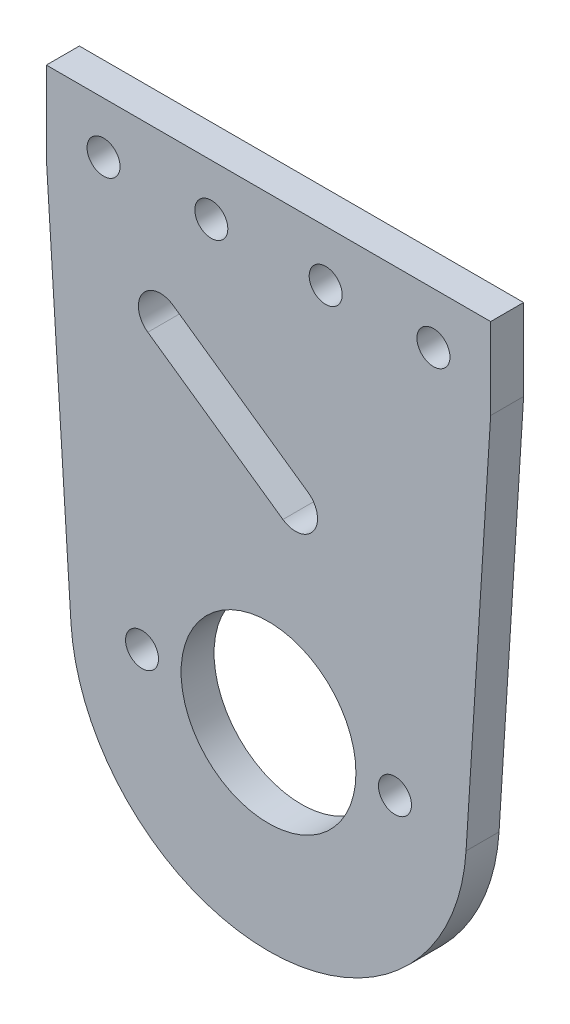
ISO-10303-21;
HEADER;
FILE_DESCRIPTION(('STEP AP214'),'2;1');
FILE_NAME('part.step','',(''),(''),'','','');
FILE_SCHEMA(('AUTOMOTIVE_DESIGN { 1 0 10303 214 1 1 1 1 }'));
ENDSEC;
DATA;
#1=APPLICATION_CONTEXT('core data for automotive mechanical design processes');
#2=APPLICATION_PROTOCOL_DEFINITION('international standard','automotive_design',2000,#1);
#3=PRODUCT_CONTEXT('',#1,'mechanical');
#4=PRODUCT('Part','Part','',(#3));
#5=PRODUCT_RELATED_PRODUCT_CATEGORY('part','',(#4));
#6=PRODUCT_DEFINITION_FORMATION('','',#4);
#7=PRODUCT_DEFINITION_CONTEXT('part definition',#1,'design');
#8=PRODUCT_DEFINITION('design','',#6,#7);
#9=PRODUCT_DEFINITION_SHAPE('','',#8);
#10=(LENGTH_UNIT() NAMED_UNIT(*) SI_UNIT(.MILLI.,.METRE.));
#11=(NAMED_UNIT(*) PLANE_ANGLE_UNIT() SI_UNIT($,.RADIAN.));
#12=(NAMED_UNIT(*) SI_UNIT($,.STERADIAN.) SOLID_ANGLE_UNIT());
#13=UNCERTAINTY_MEASURE_WITH_UNIT(LENGTH_MEASURE(1.E-05),#10,'distance_accuracy_value','');
#14=(GEOMETRIC_REPRESENTATION_CONTEXT(3) GLOBAL_UNCERTAINTY_ASSIGNED_CONTEXT((#13)) GLOBAL_UNIT_ASSIGNED_CONTEXT((#10,
#11,#12)) REPRESENTATION_CONTEXT('',''));
#15=CARTESIAN_POINT('',(0.,0.,0.));
#16=DIRECTION('',(0.,0.,1.));
#17=DIRECTION('',(1.,0.,0.));
#18=AXIS2_PLACEMENT_3D('',#15,#16,#17);
#19=CARTESIAN_POINT('',(0.,0.,3.));
#20=DIRECTION('',(0.,0.,1.));
#21=DIRECTION('',(1.,0.,0.));
#22=AXIS2_PLACEMENT_3D('',#19,#20,#21);
#23=PLANE('',#22);
#24=CARTESIAN_POINT('',(-9.82982453146787,26.8829172362126,3.));
#25=DIRECTION('',(0.,0.,1.));
#26=DIRECTION('',(1.,0.,0.));
#27=AXIS2_PLACEMENT_3D('',#24,#25,#26);
#28=CIRCLE('',#27,2.);
#29=CARTESIAN_POINT('',(-8.68267165876577,28.5212213247906,3.));
#30=VERTEX_POINT('',#29);
#31=CARTESIAN_POINT('',(-10.97697740417,25.2446131476346,3.));
#32=VERTEX_POINT('',#31);
#33=EDGE_CURVE('E50',#30,#32,#28,.T.);
#34=ORIENTED_EDGE('',*,*,#33,.F.);
#35=DIRECTION('',(-0.819152044288989,0.57357643635105,0.));
#36=VECTOR('',#35,1.);
#37=CARTESIAN_POINT('',(-8.68267165876577,28.5212213247906,3.));
#38=LINE('',#37,#36);
#39=CARTESIAN_POINT('',(3.60460900556907,19.9175747795248,3.));
#40=VERTEX_POINT('',#39);
#41=EDGE_CURVE('E130',#40,#30,#38,.T.);
#42=ORIENTED_EDGE('',*,*,#41,.F.);
#43=CARTESIAN_POINT('',(2.45745613286697,18.2792706909468,3.));
#44=DIRECTION('',(0.,0.,1.));
#45=DIRECTION('',(1.,0.,0.));
#46=AXIS2_PLACEMENT_3D('',#43,#44,#45);
#47=CIRCLE('',#46,2.);
#48=CARTESIAN_POINT('',(1.31030326016487,16.6409666023689,3.));
#49=VERTEX_POINT('',#48);
#50=EDGE_CURVE('E133',#49,#40,#47,.T.);
#51=ORIENTED_EDGE('',*,*,#50,.F.);
#52=DIRECTION('',(0.819152044288989,-0.57357643635105,0.));
#53=VECTOR('',#52,1.);
#54=CARTESIAN_POINT('',(-10.97697740417,25.2446131476346,3.));
#55=LINE('',#54,#53);
#56=EDGE_CURVE('E139',#32,#49,#55,.T.);
#57=ORIENTED_EDGE('',*,*,#56,.F.);
#58=EDGE_LOOP('',(#34,#42,#51,#57));
#59=FACE_BOUND('',#58,.T.);
#60=CARTESIAN_POINT('',(11.5,0.,3.));
#61=DIRECTION('',(0.,0.,1.));
#62=DIRECTION('',(1.,0.,0.));
#63=AXIS2_PLACEMENT_3D('',#60,#61,#62);
#64=CIRCLE('',#63,1.5);
#65=CARTESIAN_POINT('',(13.,0.,3.));
#66=VERTEX_POINT('',#65);
#67=EDGE_CURVE('E145',#66,#66,#64,.T.);
#68=ORIENTED_EDGE('',*,*,#67,.F.);
#69=EDGE_LOOP('',(#68));
#70=FACE_BOUND('',#69,.T.);
#71=CARTESIAN_POINT('',(-11.5,0.,3.));
#72=DIRECTION('',(0.,0.,1.));
#73=DIRECTION('',(1.,0.,0.));
#74=AXIS2_PLACEMENT_3D('',#71,#72,#73);
#75=CIRCLE('',#74,1.5);
#76=CARTESIAN_POINT('',(-10.,0.,3.));
#77=VERTEX_POINT('',#76);
#78=EDGE_CURVE('E154',#77,#77,#75,.T.);
#79=ORIENTED_EDGE('',*,*,#78,.F.);
#80=EDGE_LOOP('',(#79));
#81=FACE_BOUND('',#80,.T.);
#82=CARTESIAN_POINT('',(5.19999999999999,37.0240523814777,3.));
#83=DIRECTION('',(0.,0.,1.));
#84=DIRECTION('',(1.,0.,0.));
#85=AXIS2_PLACEMENT_3D('',#82,#83,#84);
#86=CIRCLE('',#85,1.5);
#87=CARTESIAN_POINT('',(6.69999999999999,37.0240523814777,3.));
#88=VERTEX_POINT('',#87);
#89=EDGE_CURVE('E167',#88,#88,#86,.T.);
#90=ORIENTED_EDGE('',*,*,#89,.F.);
#91=EDGE_LOOP('',(#90));
#92=FACE_BOUND('',#91,.T.);
#93=CARTESIAN_POINT('',(-15.,37.0240523814777,3.));
#94=DIRECTION('',(0.,0.,1.));
#95=DIRECTION('',(1.,0.,0.));
#96=AXIS2_PLACEMENT_3D('',#93,#94,#95);
#97=CIRCLE('',#96,1.5);
#98=CARTESIAN_POINT('',(-13.5,37.0240523814777,3.));
#99=VERTEX_POINT('',#98);
#100=EDGE_CURVE('E179',#99,#99,#97,.T.);
#101=ORIENTED_EDGE('',*,*,#100,.F.);
#102=EDGE_LOOP('',(#101));
#103=FACE_BOUND('',#102,.T.);
#104=DIRECTION('',(-1.,0.,0.));
#105=VECTOR('',#104,1.);
#106=CARTESIAN_POINT('',(-20.2,41.6740523814777,3.));
#107=LINE('',#106,#105);
#108=CARTESIAN_POINT('',(20.2,41.6740523814777,3.));
#109=VERTEX_POINT('',#108);
#110=CARTESIAN_POINT('',(-20.2,41.6740523814777,3.));
#111=VERTEX_POINT('',#110);
#112=EDGE_CURVE('E191',#109,#111,#107,.T.);
#113=ORIENTED_EDGE('',*,*,#112,.T.);
#114=DIRECTION('',(0.,-1.,0.));
#115=VECTOR('',#114,1.);
#116=CARTESIAN_POINT('',(-20.2,41.6740523814777,3.));
#117=LINE('',#116,#115);
#118=CARTESIAN_POINT('',(-20.2,34.2740523814777,3.));
#119=VERTEX_POINT('',#118);
#120=EDGE_CURVE('E194',#111,#119,#117,.T.);
#121=ORIENTED_EDGE('',*,*,#120,.T.);
#122=DIRECTION('',(0.0630171014224318,-0.998012447281253,0.));
#123=VECTOR('',#122,1.);
#124=CARTESIAN_POINT('',(-20.2,34.2740523814777,3.));
#125=LINE('',#124,#123);
#126=CARTESIAN_POINT('',(-17.9642240510625,-1.13430782560377,3.));
#127=VERTEX_POINT('',#126);
#128=EDGE_CURVE('E197',#119,#127,#125,.T.);
#129=ORIENTED_EDGE('',*,*,#128,.T.);
#130=CARTESIAN_POINT('',(0.,0.,3.));
#131=DIRECTION('',(0.,0.,1.));
#132=DIRECTION('',(1.,0.,0.));
#133=AXIS2_PLACEMENT_3D('',#130,#131,#132);
#134=CIRCLE('',#133,18.);
#135=CARTESIAN_POINT('',(17.9642240510626,-1.13430782560376,3.));
#136=VERTEX_POINT('',#135);
#137=EDGE_CURVE('E199',#127,#136,#134,.T.);
#138=ORIENTED_EDGE('',*,*,#137,.T.);
#139=DIRECTION('',(0.0630171014224309,0.998012447281253,0.));
#140=VECTOR('',#139,1.);
#141=CARTESIAN_POINT('',(20.2,34.2740523814777,3.));
#142=LINE('',#141,#140);
#143=CARTESIAN_POINT('',(20.2,34.2740523814777,3.));
#144=VERTEX_POINT('',#143);
#145=EDGE_CURVE('E201',#136,#144,#142,.T.);
#146=ORIENTED_EDGE('',*,*,#145,.T.);
#147=DIRECTION('',(0.,1.,0.));
#148=VECTOR('',#147,1.);
#149=CARTESIAN_POINT('',(20.2,41.6740523814777,3.));
#150=LINE('',#149,#148);
#151=EDGE_CURVE('E203',#144,#109,#150,.T.);
#152=ORIENTED_EDGE('',*,*,#151,.T.);
#153=EDGE_LOOP('',(#113,#121,#129,#138,#146,#152));
#154=FACE_BOUND('',#153,.T.);
#155=CARTESIAN_POINT('',(0.,0.,3.));
#156=DIRECTION('',(0.,0.,1.));
#157=DIRECTION('',(1.,0.,0.));
#158=AXIS2_PLACEMENT_3D('',#155,#156,#157);
#159=CIRCLE('',#158,7.95);
#160=CARTESIAN_POINT('',(7.95,0.,3.));
#161=VERTEX_POINT('',#160);
#162=EDGE_CURVE('E185',#161,#161,#159,.T.);
#163=ORIENTED_EDGE('',*,*,#162,.F.);
#164=EDGE_LOOP('',(#163));
#165=FACE_BOUND('',#164,.T.);
#166=CARTESIAN_POINT('',(-5.20000000000001,37.0240523814777,3.));
#167=DIRECTION('',(0.,0.,1.));
#168=DIRECTION('',(1.,0.,0.));
#169=AXIS2_PLACEMENT_3D('',#166,#167,#168);
#170=CIRCLE('',#169,1.5);
#171=CARTESIAN_POINT('',(-3.70000000000001,37.0240523814777,3.));
#172=VERTEX_POINT('',#171);
#173=EDGE_CURVE('E173',#172,#172,#170,.T.);
#174=ORIENTED_EDGE('',*,*,#173,.F.);
#175=EDGE_LOOP('',(#174));
#176=FACE_BOUND('',#175,.T.);
#177=CARTESIAN_POINT('',(15.,37.0240523814777,3.));
#178=DIRECTION('',(0.,0.,1.));
#179=DIRECTION('',(1.,0.,0.));
#180=AXIS2_PLACEMENT_3D('',#177,#178,#179);
#181=CIRCLE('',#180,1.49999999999999);
#182=CARTESIAN_POINT('',(16.5,37.0240523814777,3.));
#183=VERTEX_POINT('',#182);
#184=EDGE_CURVE('E161',#183,#183,#181,.T.);
#185=ORIENTED_EDGE('',*,*,#184,.F.);
#186=EDGE_LOOP('',(#185));
#187=FACE_BOUND('',#186,.T.);
#188=ADVANCED_FACE('F35',(#59,#70,#81,#92,#103,#154,#165,#176,#187),#23,.T.);
#189=CARTESIAN_POINT('',(0.,0.,0.));
#190=DIRECTION('',(0.,0.,1.));
#191=DIRECTION('',(1.,0.,0.));
#192=AXIS2_PLACEMENT_3D('',#189,#190,#191);
#193=PLANE('',#192);
#194=DIRECTION('',(-0.819152044288989,0.57357643635105,0.));
#195=VECTOR('',#194,1.);
#196=CARTESIAN_POINT('',(-8.68267165876577,28.5212213247906,0.));
#197=LINE('',#196,#195);
#198=CARTESIAN_POINT('',(3.60460900556907,19.9175747795248,0.));
#199=VERTEX_POINT('',#198);
#200=CARTESIAN_POINT('',(-8.68267165876577,28.5212213247906,0.));
#201=VERTEX_POINT('',#200);
#202=EDGE_CURVE('E120',#199,#201,#197,.T.);
#203=ORIENTED_EDGE('',*,*,#202,.T.);
#204=CARTESIAN_POINT('',(-9.82982453146787,26.8829172362126,0.));
#205=DIRECTION('',(0.,0.,1.));
#206=DIRECTION('',(1.,0.,0.));
#207=AXIS2_PLACEMENT_3D('',#204,#205,#206);
#208=CIRCLE('',#207,2.);
#209=CARTESIAN_POINT('',(-10.97697740417,25.2446131476346,0.));
#210=VERTEX_POINT('',#209);
#211=EDGE_CURVE('E114',#201,#210,#208,.T.);
#212=ORIENTED_EDGE('',*,*,#211,.T.);
#213=DIRECTION('',(0.819152044288989,-0.57357643635105,0.));
#214=VECTOR('',#213,1.);
#215=CARTESIAN_POINT('',(-10.97697740417,25.2446131476346,0.));
#216=LINE('',#215,#214);
#217=CARTESIAN_POINT('',(1.31030326016486,16.6409666023689,0.));
#218=VERTEX_POINT('',#217);
#219=EDGE_CURVE('E123',#210,#218,#216,.T.);
#220=ORIENTED_EDGE('',*,*,#219,.T.);
#221=CARTESIAN_POINT('',(2.45745613286697,18.2792706909468,0.));
#222=DIRECTION('',(0.,0.,1.));
#223=DIRECTION('',(1.,0.,0.));
#224=AXIS2_PLACEMENT_3D('',#221,#222,#223);
#225=CIRCLE('',#224,2.);
#226=EDGE_CURVE('E58',#218,#199,#225,.T.);
#227=ORIENTED_EDGE('',*,*,#226,.T.);
#228=EDGE_LOOP('',(#203,#212,#220,#227));
#229=FACE_BOUND('',#228,.T.);
#230=CARTESIAN_POINT('',(11.5,0.,0.));
#231=DIRECTION('',(0.,0.,1.));
#232=DIRECTION('',(1.,0.,0.));
#233=AXIS2_PLACEMENT_3D('',#230,#231,#232);
#234=CIRCLE('',#233,1.5);
#235=CARTESIAN_POINT('',(13.,0.,0.));
#236=VERTEX_POINT('',#235);
#237=EDGE_CURVE('E151',#236,#236,#234,.F.);
#238=ORIENTED_EDGE('',*,*,#237,.F.);
#239=EDGE_LOOP('',(#238));
#240=FACE_BOUND('',#239,.T.);
#241=CARTESIAN_POINT('',(-11.5,0.,0.));
#242=DIRECTION('',(0.,0.,1.));
#243=DIRECTION('',(1.,0.,0.));
#244=AXIS2_PLACEMENT_3D('',#241,#242,#243);
#245=CIRCLE('',#244,1.5);
#246=CARTESIAN_POINT('',(-10.,0.,0.));
#247=VERTEX_POINT('',#246);
#248=EDGE_CURVE('E157',#247,#247,#245,.F.);
#249=ORIENTED_EDGE('',*,*,#248,.F.);
#250=EDGE_LOOP('',(#249));
#251=FACE_BOUND('',#250,.T.);
#252=CARTESIAN_POINT('',(5.19999999999999,37.0240523814777,0.));
#253=DIRECTION('',(0.,0.,1.));
#254=DIRECTION('',(1.,0.,0.));
#255=AXIS2_PLACEMENT_3D('',#252,#253,#254);
#256=CIRCLE('',#255,1.5);
#257=CARTESIAN_POINT('',(6.69999999999999,37.0240523814777,0.));
#258=VERTEX_POINT('',#257);
#259=EDGE_CURVE('E164',#258,#258,#256,.T.);
#260=ORIENTED_EDGE('',*,*,#259,.T.);
#261=EDGE_LOOP('',(#260));
#262=FACE_BOUND('',#261,.T.);
#263=CARTESIAN_POINT('',(-15.,37.0240523814777,0.));
#264=DIRECTION('',(0.,0.,1.));
#265=DIRECTION('',(1.,0.,0.));
#266=AXIS2_PLACEMENT_3D('',#263,#264,#265);
#267=CIRCLE('',#266,1.5);
#268=CARTESIAN_POINT('',(-13.5,37.0240523814777,0.));
#269=VERTEX_POINT('',#268);
#270=EDGE_CURVE('E176',#269,#269,#267,.T.);
#271=ORIENTED_EDGE('',*,*,#270,.T.);
#272=EDGE_LOOP('',(#271));
#273=FACE_BOUND('',#272,.T.);
#274=DIRECTION('',(0.,-1.,0.));
#275=VECTOR('',#274,1.);
#276=CARTESIAN_POINT('',(-20.2,41.6740523814777,0.));
#277=LINE('',#276,#275);
#278=CARTESIAN_POINT('',(-20.2,41.6740523814777,0.));
#279=VERTEX_POINT('',#278);
#280=CARTESIAN_POINT('',(-20.2,34.2740523814777,0.));
#281=VERTEX_POINT('',#280);
#282=EDGE_CURVE('E188',#279,#281,#277,.T.);
#283=ORIENTED_EDGE('',*,*,#282,.F.);
#284=DIRECTION('',(-1.,0.,0.));
#285=VECTOR('',#284,1.);
#286=CARTESIAN_POINT('',(0.,41.6740523814777,0.));
#287=LINE('',#286,#285);
#288=CARTESIAN_POINT('',(20.2,41.6740523814777,0.));
#289=VERTEX_POINT('',#288);
#290=EDGE_CURVE('E195',#289,#279,#287,.T.);
#291=ORIENTED_EDGE('',*,*,#290,.F.);
#292=DIRECTION('',(0.,1.,0.));
#293=VECTOR('',#292,1.);
#294=CARTESIAN_POINT('',(20.2,41.6740523814777,0.));
#295=LINE('',#294,#293);
#296=CARTESIAN_POINT('',(20.2,34.2740523814777,0.));
#297=VERTEX_POINT('',#296);
#298=EDGE_CURVE('E214',#297,#289,#295,.T.);
#299=ORIENTED_EDGE('',*,*,#298,.F.);
#300=DIRECTION('',(0.0630171014224309,0.998012447281253,0.));
#301=VECTOR('',#300,1.);
#302=CARTESIAN_POINT('',(20.2,34.2740523814777,0.));
#303=LINE('',#302,#301);
#304=CARTESIAN_POINT('',(17.9642240510626,-1.13430782560376,0.));
#305=VERTEX_POINT('',#304);
#306=EDGE_CURVE('E212',#305,#297,#303,.T.);
#307=ORIENTED_EDGE('',*,*,#306,.F.);
#308=CARTESIAN_POINT('',(0.,0.,0.));
#309=DIRECTION('',(0.,0.,1.));
#310=DIRECTION('',(1.,0.,0.));
#311=AXIS2_PLACEMENT_3D('',#308,#309,#310);
#312=CIRCLE('',#311,18.);
#313=CARTESIAN_POINT('',(-17.9642240510625,-1.13430782560377,0.));
#314=VERTEX_POINT('',#313);
#315=EDGE_CURVE('E210',#314,#305,#312,.T.);
#316=ORIENTED_EDGE('',*,*,#315,.F.);
#317=DIRECTION('',(0.0630171014224318,-0.998012447281253,0.));
#318=VECTOR('',#317,1.);
#319=CARTESIAN_POINT('',(-20.2,34.2740523814777,0.));
#320=LINE('',#319,#318);
#321=EDGE_CURVE('E208',#281,#314,#320,.T.);
#322=ORIENTED_EDGE('',*,*,#321,.F.);
#323=EDGE_LOOP('',(#283,#291,#299,#307,#316,#322));
#324=FACE_BOUND('',#323,.T.);
#325=CARTESIAN_POINT('',(0.,0.,0.));
#326=DIRECTION('',(0.,0.,1.));
#327=DIRECTION('',(1.,0.,0.));
#328=AXIS2_PLACEMENT_3D('',#325,#326,#327);
#329=CIRCLE('',#328,7.95);
#330=CARTESIAN_POINT('',(7.95,0.,0.));
#331=VERTEX_POINT('',#330);
#332=EDGE_CURVE('E182',#331,#331,#329,.T.);
#333=ORIENTED_EDGE('',*,*,#332,.T.);
#334=EDGE_LOOP('',(#333));
#335=FACE_BOUND('',#334,.T.);
#336=CARTESIAN_POINT('',(-5.20000000000001,37.0240523814777,0.));
#337=DIRECTION('',(0.,0.,1.));
#338=DIRECTION('',(1.,0.,0.));
#339=AXIS2_PLACEMENT_3D('',#336,#337,#338);
#340=CIRCLE('',#339,1.5);
#341=CARTESIAN_POINT('',(-3.70000000000001,37.0240523814777,0.));
#342=VERTEX_POINT('',#341);
#343=EDGE_CURVE('E170',#342,#342,#340,.T.);
#344=ORIENTED_EDGE('',*,*,#343,.T.);
#345=EDGE_LOOP('',(#344));
#346=FACE_BOUND('',#345,.T.);
#347=CARTESIAN_POINT('',(15.,37.0240523814777,0.));
#348=DIRECTION('',(0.,0.,1.));
#349=DIRECTION('',(1.,0.,0.));
#350=AXIS2_PLACEMENT_3D('',#347,#348,#349);
#351=CIRCLE('',#350,1.49999999999999);
#352=CARTESIAN_POINT('',(16.5,37.0240523814777,0.));
#353=VERTEX_POINT('',#352);
#354=EDGE_CURVE('E160',#353,#353,#351,.T.);
#355=ORIENTED_EDGE('',*,*,#354,.T.);
#356=EDGE_LOOP('',(#355));
#357=FACE_BOUND('',#356,.T.);
#358=ADVANCED_FACE('F127',(#229,#240,#251,#262,#273,#324,#335,#346,#357),#193,.F.);
#359=CARTESIAN_POINT('',(-20.2,41.6740523814777,3.));
#360=DIRECTION('',(1.,0.,0.));
#361=DIRECTION('',(0.,0.,-1.));
#362=AXIS2_PLACEMENT_3D('',#359,#360,#361);
#363=PLANE('',#362);
#364=ORIENTED_EDGE('',*,*,#282,.T.);
#365=DIRECTION('',(0.,0.,-1.));
#366=VECTOR('',#365,1.);
#367=CARTESIAN_POINT('',(-20.2,34.2740523814777,3.));
#368=LINE('',#367,#366);
#369=EDGE_CURVE('E43',#119,#281,#368,.T.);
#370=ORIENTED_EDGE('',*,*,#369,.F.);
#371=ORIENTED_EDGE('',*,*,#120,.F.);
#372=DIRECTION('',(0.,0.,-1.));
#373=VECTOR('',#372,1.);
#374=CARTESIAN_POINT('',(-20.2,41.6740523814777,3.));
#375=LINE('',#374,#373);
#376=EDGE_CURVE('E11',#111,#279,#375,.T.);
#377=ORIENTED_EDGE('',*,*,#376,.T.);
#378=EDGE_LOOP('',(#364,#370,#371,#377));
#379=FACE_BOUND('',#378,.T.);
#380=ADVANCED_FACE('F37',(#379),#363,.F.);
#381=CARTESIAN_POINT('',(-20.2,34.2740523814777,3.));
#382=DIRECTION('',(0.998012447281252,0.0630171014224318,0.));
#383=DIRECTION('',(-0.0630171014224318,0.998012447281253,0.));
#384=AXIS2_PLACEMENT_3D('',#381,#382,#383);
#385=PLANE('',#384);
#386=ORIENTED_EDGE('',*,*,#321,.T.);
#387=DIRECTION('',(0.,0.,-1.));
#388=VECTOR('',#387,1.);
#389=CARTESIAN_POINT('',(-17.9642240510625,-1.13430782560377,3.));
#390=LINE('',#389,#388);
#391=EDGE_CURVE('E225',#127,#314,#390,.T.);
#392=ORIENTED_EDGE('',*,*,#391,.F.);
#393=ORIENTED_EDGE('',*,*,#128,.F.);
#394=ORIENTED_EDGE('',*,*,#369,.T.);
#395=EDGE_LOOP('',(#386,#392,#393,#394));
#396=FACE_BOUND('',#395,.T.);
#397=ADVANCED_FACE('F232',(#396),#385,.F.);
#398=CARTESIAN_POINT('',(0.,0.,3.));
#399=DIRECTION('',(0.,0.,-1.));
#400=DIRECTION('',(-1.,0.,0.));
#401=AXIS2_PLACEMENT_3D('',#398,#399,#400);
#402=CYLINDRICAL_SURFACE('',#401,18.);
#403=ORIENTED_EDGE('',*,*,#315,.T.);
#404=DIRECTION('',(0.,0.,-1.));
#405=VECTOR('',#404,1.);
#406=CARTESIAN_POINT('',(17.9642240510626,-1.13430782560376,3.));
#407=LINE('',#406,#405);
#408=EDGE_CURVE('E222',#136,#305,#407,.T.);
#409=ORIENTED_EDGE('',*,*,#408,.F.);
#410=ORIENTED_EDGE('',*,*,#137,.F.);
#411=ORIENTED_EDGE('',*,*,#391,.T.);
#412=EDGE_LOOP('',(#403,#409,#410,#411));
#413=FACE_BOUND('',#412,.T.);
#414=ADVANCED_FACE('F244',(#413),#402,.T.);
#415=CARTESIAN_POINT('',(20.2,34.2740523814777,3.));
#416=DIRECTION('',(-0.998012447281253,0.0630171014224309,0.));
#417=DIRECTION('',(-0.0630171014224309,-0.998012447281253,0.));
#418=AXIS2_PLACEMENT_3D('',#415,#416,#417);
#419=PLANE('',#418);
#420=ORIENTED_EDGE('',*,*,#306,.T.);
#421=DIRECTION('',(0.,0.,-1.));
#422=VECTOR('',#421,1.);
#423=CARTESIAN_POINT('',(20.2,34.2740523814777,3.));
#424=LINE('',#423,#422);
#425=EDGE_CURVE('E219',#144,#297,#424,.T.);
#426=ORIENTED_EDGE('',*,*,#425,.F.);
#427=ORIENTED_EDGE('',*,*,#145,.F.);
#428=ORIENTED_EDGE('',*,*,#408,.T.);
#429=EDGE_LOOP('',(#420,#426,#427,#428));
#430=FACE_BOUND('',#429,.T.);
#431=ADVANCED_FACE('F248',(#430),#419,.F.);
#432=CARTESIAN_POINT('',(20.2,41.6740523814777,3.));
#433=DIRECTION('',(-1.,0.,0.));
#434=DIRECTION('',(0.,-1.,0.));
#435=AXIS2_PLACEMENT_3D('',#432,#433,#434);
#436=PLANE('',#435);
#437=ORIENTED_EDGE('',*,*,#298,.T.);
#438=DIRECTION('',(0.,0.,-1.));
#439=VECTOR('',#438,1.);
#440=CARTESIAN_POINT('',(20.2,41.6740523814777,3.));
#441=LINE('',#440,#439);
#442=EDGE_CURVE('E206',#109,#289,#441,.T.);
#443=ORIENTED_EDGE('',*,*,#442,.F.);
#444=ORIENTED_EDGE('',*,*,#151,.F.);
#445=ORIENTED_EDGE('',*,*,#425,.T.);
#446=EDGE_LOOP('',(#437,#443,#444,#445));
#447=FACE_BOUND('',#446,.T.);
#448=ADVANCED_FACE('F258',(#447),#436,.F.);
#449=CARTESIAN_POINT('',(0.,41.6740523814777,3.));
#450=DIRECTION('',(0.,-1.,0.));
#451=DIRECTION('',(0.,0.,-1.));
#452=AXIS2_PLACEMENT_3D('',#449,#450,#451);
#453=PLANE('',#452);
#454=ORIENTED_EDGE('',*,*,#290,.T.);
#455=ORIENTED_EDGE('',*,*,#376,.F.);
#456=ORIENTED_EDGE('',*,*,#112,.F.);
#457=ORIENTED_EDGE('',*,*,#442,.T.);
#458=EDGE_LOOP('',(#454,#455,#456,#457));
#459=FACE_BOUND('',#458,.T.);
#460=ADVANCED_FACE('F256',(#459),#453,.F.);
#461=CARTESIAN_POINT('',(0.,0.,3.));
#462=DIRECTION('',(0.,0.,-1.));
#463=DIRECTION('',(-1.,0.,0.));
#464=AXIS2_PLACEMENT_3D('',#461,#462,#463);
#465=CYLINDRICAL_SURFACE('',#464,7.95);
#466=ORIENTED_EDGE('',*,*,#162,.T.);
#467=EDGE_LOOP('',(#466));
#468=FACE_BOUND('',#467,.T.);
#469=ORIENTED_EDGE('',*,*,#332,.F.);
#470=EDGE_LOOP('',(#469));
#471=FACE_BOUND('',#470,.T.);
#472=ADVANCED_FACE('F265',(#468,#471),#465,.F.);
#473=CARTESIAN_POINT('',(-15.,37.0240523814777,3.));
#474=DIRECTION('',(0.,0.,-1.));
#475=DIRECTION('',(-1.,0.,0.));
#476=AXIS2_PLACEMENT_3D('',#473,#474,#475);
#477=CYLINDRICAL_SURFACE('',#476,1.5);
#478=ORIENTED_EDGE('',*,*,#100,.T.);
#479=EDGE_LOOP('',(#478));
#480=FACE_BOUND('',#479,.T.);
#481=ORIENTED_EDGE('',*,*,#270,.F.);
#482=EDGE_LOOP('',(#481));
#483=FACE_BOUND('',#482,.T.);
#484=ADVANCED_FACE('F279',(#480,#483),#477,.F.);
#485=CARTESIAN_POINT('',(-5.20000000000001,37.0240523814777,3.));
#486=DIRECTION('',(0.,0.,-1.));
#487=DIRECTION('',(-1.,0.,0.));
#488=AXIS2_PLACEMENT_3D('',#485,#486,#487);
#489=CYLINDRICAL_SURFACE('',#488,1.5);
#490=ORIENTED_EDGE('',*,*,#173,.T.);
#491=EDGE_LOOP('',(#490));
#492=FACE_BOUND('',#491,.T.);
#493=ORIENTED_EDGE('',*,*,#343,.F.);
#494=EDGE_LOOP('',(#493));
#495=FACE_BOUND('',#494,.T.);
#496=ADVANCED_FACE('F283',(#492,#495),#489,.F.);
#497=CARTESIAN_POINT('',(5.19999999999999,37.0240523814777,3.));
#498=DIRECTION('',(0.,0.,-1.));
#499=DIRECTION('',(-1.,0.,0.));
#500=AXIS2_PLACEMENT_3D('',#497,#498,#499);
#501=CYLINDRICAL_SURFACE('',#500,1.5);
#502=ORIENTED_EDGE('',*,*,#89,.T.);
#503=EDGE_LOOP('',(#502));
#504=FACE_BOUND('',#503,.T.);
#505=ORIENTED_EDGE('',*,*,#259,.F.);
#506=EDGE_LOOP('',(#505));
#507=FACE_BOUND('',#506,.T.);
#508=ADVANCED_FACE('F287',(#504,#507),#501,.F.);
#509=CARTESIAN_POINT('',(15.,37.0240523814777,3.));
#510=DIRECTION('',(0.,0.,-1.));
#511=DIRECTION('',(-1.,0.,0.));
#512=AXIS2_PLACEMENT_3D('',#509,#510,#511);
#513=CYLINDRICAL_SURFACE('',#512,1.49999999999999);
#514=ORIENTED_EDGE('',*,*,#184,.T.);
#515=EDGE_LOOP('',(#514));
#516=FACE_BOUND('',#515,.T.);
#517=ORIENTED_EDGE('',*,*,#354,.F.);
#518=EDGE_LOOP('',(#517));
#519=FACE_BOUND('',#518,.T.);
#520=ADVANCED_FACE('F291',(#516,#519),#513,.F.);
#521=CARTESIAN_POINT('',(-11.5,0.,-0.00100000000000013));
#522=DIRECTION('',(0.,0.,1.));
#523=DIRECTION('',(1.,0.,0.));
#524=AXIS2_PLACEMENT_3D('',#521,#522,#523);
#525=CYLINDRICAL_SURFACE('',#524,1.5);
#526=CARTESIAN_POINT('',(-10.,0.,3.));
#527=CARTESIAN_POINT('',(-10.,0.,2.96875));
#528=CARTESIAN_POINT('',(-10.,0.,2.9375));
#529=CARTESIAN_POINT('',(-10.,0.,2.875));
#530=CARTESIAN_POINT('',(-10.,0.,2.84375));
#531=CARTESIAN_POINT('',(-10.,0.,2.78125));
#532=CARTESIAN_POINT('',(-10.,0.,2.75));
#533=CARTESIAN_POINT('',(-10.,0.,2.6875));
#534=CARTESIAN_POINT('',(-10.,0.,2.65625));
#535=CARTESIAN_POINT('',(-10.,0.,2.59375));
#536=CARTESIAN_POINT('',(-10.,0.,2.5625));
#537=CARTESIAN_POINT('',(-10.,0.,2.5));
#538=CARTESIAN_POINT('',(-10.,0.,2.46875));
#539=CARTESIAN_POINT('',(-10.,0.,2.40625));
#540=CARTESIAN_POINT('',(-10.,0.,2.375));
#541=CARTESIAN_POINT('',(-10.,0.,2.3125));
#542=CARTESIAN_POINT('',(-10.,0.,2.28125));
#543=CARTESIAN_POINT('',(-10.,0.,2.21875));
#544=CARTESIAN_POINT('',(-10.,0.,2.1875));
#545=CARTESIAN_POINT('',(-10.,0.,2.125));
#546=CARTESIAN_POINT('',(-10.,0.,2.09375));
#547=CARTESIAN_POINT('',(-10.,0.,2.03125));
#548=CARTESIAN_POINT('',(-10.,0.,2.));
#549=CARTESIAN_POINT('',(-10.,0.,1.9375));
#550=CARTESIAN_POINT('',(-10.,0.,1.90625));
#551=CARTESIAN_POINT('',(-10.,0.,1.84375));
#552=CARTESIAN_POINT('',(-10.,0.,1.8125));
#553=CARTESIAN_POINT('',(-10.,0.,1.75));
#554=CARTESIAN_POINT('',(-10.,0.,1.71875));
#555=CARTESIAN_POINT('',(-10.,0.,1.65625));
#556=CARTESIAN_POINT('',(-10.,0.,1.625));
#557=CARTESIAN_POINT('',(-10.,0.,1.5625));
#558=CARTESIAN_POINT('',(-10.,0.,1.53125));
#559=CARTESIAN_POINT('',(-10.,0.,1.46875));
#560=CARTESIAN_POINT('',(-10.,0.,1.4375));
#561=CARTESIAN_POINT('',(-10.,0.,1.375));
#562=CARTESIAN_POINT('',(-10.,0.,1.34375));
#563=CARTESIAN_POINT('',(-10.,0.,1.28125));
#564=CARTESIAN_POINT('',(-10.,0.,1.25));
#565=CARTESIAN_POINT('',(-10.,0.,1.1875));
#566=CARTESIAN_POINT('',(-10.,0.,1.15625));
#567=CARTESIAN_POINT('',(-10.,0.,1.09375));
#568=CARTESIAN_POINT('',(-10.,0.,1.0625));
#569=CARTESIAN_POINT('',(-10.,0.,1.));
#570=CARTESIAN_POINT('',(-10.,0.,0.96875));
#571=CARTESIAN_POINT('',(-10.,0.,0.90625));
#572=CARTESIAN_POINT('',(-10.,0.,0.875));
#573=CARTESIAN_POINT('',(-10.,0.,0.8125));
#574=CARTESIAN_POINT('',(-10.,0.,0.78125));
#575=CARTESIAN_POINT('',(-10.,0.,0.71875));
#576=CARTESIAN_POINT('',(-10.,0.,0.6875));
#577=CARTESIAN_POINT('',(-10.,0.,0.625));
#578=CARTESIAN_POINT('',(-10.,0.,0.59375));
#579=CARTESIAN_POINT('',(-10.,0.,0.53125));
#580=CARTESIAN_POINT('',(-10.,0.,0.5));
#581=CARTESIAN_POINT('',(-10.,0.,0.4375));
#582=CARTESIAN_POINT('',(-10.,0.,0.40625));
#583=CARTESIAN_POINT('',(-10.,0.,0.34375));
#584=CARTESIAN_POINT('',(-10.,0.,0.3125));
#585=CARTESIAN_POINT('',(-10.,0.,0.25));
#586=CARTESIAN_POINT('',(-10.,0.,0.21875));
#587=CARTESIAN_POINT('',(-10.,0.,0.15625));
#588=CARTESIAN_POINT('',(-10.,0.,0.125));
#589=CARTESIAN_POINT('',(-10.,0.,0.0625000000000001));
#590=CARTESIAN_POINT('',(-10.,0.,0.0312500000000001));
#591=CARTESIAN_POINT('',(-10.,0.,0.));
#592=B_SPLINE_CURVE_WITH_KNOTS('',3,(#526,#527,#528,#529,#530,#531,#532,#533,#534,#535,#536,
#537,#538,#539,#540,#541,#542,#543,#544,#545,#546,#547,#548,#549,#550,#551,#552,#553,#554,#555,
#556,#557,#558,#559,#560,#561,#562,#563,#564,#565,#566,#567,#568,#569,#570,#571,#572,#573,#574,
#575,#576,#577,#578,#579,#580,#581,#582,#583,#584,#585,#586,#587,#588,#589,#590,#591),
.UNSPECIFIED.,.F.,.F.,(4,2,2,2,2,2,2,2,2,2,2,2,2,2,2,2,2,2,2,2,2,2,2,2,2,2,2,2,2,2,2,2,4),(0.,
0.0937500000000001,0.1875,0.28125,0.375,0.46875,0.5625,0.65625,0.75,0.84375,0.9375,1.03125,
1.125,1.21875,1.3125,1.40625,1.5,1.59375,1.6875,1.78125,1.875,1.96875,2.0625,2.15625,2.25,
2.34375,2.4375,2.53125,2.625,2.71875,2.8125,2.90625,3.),.UNSPECIFIED.);
#593=EDGE_CURVE('BSEAM295',#77,#247,#592,.T.);
#594=ORIENTED_EDGE('',*,*,#78,.T.);
#595=ORIENTED_EDGE('',*,*,#248,.T.);
#596=ORIENTED_EDGE('',*,*,#593,.T.);
#597=ORIENTED_EDGE('',*,*,#593,.F.);
#598=EDGE_LOOP('',(#594,#596,#595,#597));
#599=FACE_BOUND('',#598,.T.);
#600=ADVANCED_FACE('F295',(#599),#525,.F.);
#601=CARTESIAN_POINT('',(11.5,0.,-0.00100000000000013));
#602=DIRECTION('',(0.,0.,1.));
#603=DIRECTION('',(1.,0.,0.));
#604=AXIS2_PLACEMENT_3D('',#601,#602,#603);
#605=CYLINDRICAL_SURFACE('',#604,1.5);
#606=CARTESIAN_POINT('',(13.,0.,3.));
#607=CARTESIAN_POINT('',(13.,0.,2.96875));
#608=CARTESIAN_POINT('',(13.,0.,2.9375));
#609=CARTESIAN_POINT('',(13.,0.,2.875));
#610=CARTESIAN_POINT('',(13.,0.,2.84375));
#611=CARTESIAN_POINT('',(13.,0.,2.78125));
#612=CARTESIAN_POINT('',(13.,0.,2.75));
#613=CARTESIAN_POINT('',(13.,0.,2.6875));
#614=CARTESIAN_POINT('',(13.,0.,2.65625));
#615=CARTESIAN_POINT('',(13.,0.,2.59375));
#616=CARTESIAN_POINT('',(13.,0.,2.5625));
#617=CARTESIAN_POINT('',(13.,0.,2.5));
#618=CARTESIAN_POINT('',(13.,0.,2.46875));
#619=CARTESIAN_POINT('',(13.,0.,2.40625));
#620=CARTESIAN_POINT('',(13.,0.,2.375));
#621=CARTESIAN_POINT('',(13.,0.,2.3125));
#622=CARTESIAN_POINT('',(13.,0.,2.28125));
#623=CARTESIAN_POINT('',(13.,0.,2.21875));
#624=CARTESIAN_POINT('',(13.,0.,2.1875));
#625=CARTESIAN_POINT('',(13.,0.,2.125));
#626=CARTESIAN_POINT('',(13.,0.,2.09375));
#627=CARTESIAN_POINT('',(13.,0.,2.03125));
#628=CARTESIAN_POINT('',(13.,0.,2.));
#629=CARTESIAN_POINT('',(13.,0.,1.9375));
#630=CARTESIAN_POINT('',(13.,0.,1.90625));
#631=CARTESIAN_POINT('',(13.,0.,1.84375));
#632=CARTESIAN_POINT('',(13.,0.,1.8125));
#633=CARTESIAN_POINT('',(13.,0.,1.75));
#634=CARTESIAN_POINT('',(13.,0.,1.71875));
#635=CARTESIAN_POINT('',(13.,0.,1.65625));
#636=CARTESIAN_POINT('',(13.,0.,1.625));
#637=CARTESIAN_POINT('',(13.,0.,1.5625));
#638=CARTESIAN_POINT('',(13.,0.,1.53125));
#639=CARTESIAN_POINT('',(13.,0.,1.46875));
#640=CARTESIAN_POINT('',(13.,0.,1.4375));
#641=CARTESIAN_POINT('',(13.,0.,1.375));
#642=CARTESIAN_POINT('',(13.,0.,1.34375));
#643=CARTESIAN_POINT('',(13.,0.,1.28125));
#644=CARTESIAN_POINT('',(13.,0.,1.25));
#645=CARTESIAN_POINT('',(13.,0.,1.1875));
#646=CARTESIAN_POINT('',(13.,0.,1.15625));
#647=CARTESIAN_POINT('',(13.,0.,1.09375));
#648=CARTESIAN_POINT('',(13.,0.,1.0625));
#649=CARTESIAN_POINT('',(13.,0.,1.));
#650=CARTESIAN_POINT('',(13.,0.,0.96875));
#651=CARTESIAN_POINT('',(13.,0.,0.90625));
#652=CARTESIAN_POINT('',(13.,0.,0.875));
#653=CARTESIAN_POINT('',(13.,0.,0.8125));
#654=CARTESIAN_POINT('',(13.,0.,0.78125));
#655=CARTESIAN_POINT('',(13.,0.,0.71875));
#656=CARTESIAN_POINT('',(13.,0.,0.6875));
#657=CARTESIAN_POINT('',(13.,0.,0.625));
#658=CARTESIAN_POINT('',(13.,0.,0.59375));
#659=CARTESIAN_POINT('',(13.,0.,0.53125));
#660=CARTESIAN_POINT('',(13.,0.,0.5));
#661=CARTESIAN_POINT('',(13.,0.,0.4375));
#662=CARTESIAN_POINT('',(13.,0.,0.40625));
#663=CARTESIAN_POINT('',(13.,0.,0.34375));
#664=CARTESIAN_POINT('',(13.,0.,0.3125));
#665=CARTESIAN_POINT('',(13.,0.,0.25));
#666=CARTESIAN_POINT('',(13.,0.,0.21875));
#667=CARTESIAN_POINT('',(13.,0.,0.15625));
#668=CARTESIAN_POINT('',(13.,0.,0.125));
#669=CARTESIAN_POINT('',(13.,0.,0.0625000000000001));
#670=CARTESIAN_POINT('',(13.,0.,0.0312500000000001));
#671=CARTESIAN_POINT('',(13.,0.,0.));
#672=B_SPLINE_CURVE_WITH_KNOTS('',3,(#606,#607,#608,#609,#610,#611,#612,#613,#614,#615,#616,
#617,#618,#619,#620,#621,#622,#623,#624,#625,#626,#627,#628,#629,#630,#631,#632,#633,#634,#635,
#636,#637,#638,#639,#640,#641,#642,#643,#644,#645,#646,#647,#648,#649,#650,#651,#652,#653,#654,
#655,#656,#657,#658,#659,#660,#661,#662,#663,#664,#665,#666,#667,#668,#669,#670,#671),
.UNSPECIFIED.,.F.,.F.,(4,2,2,2,2,2,2,2,2,2,2,2,2,2,2,2,2,2,2,2,2,2,2,2,2,2,2,2,2,2,2,2,4),(0.,
0.0937500000000001,0.1875,0.28125,0.375,0.46875,0.5625,0.65625,0.75,0.84375,0.9375,1.03125,
1.125,1.21875,1.3125,1.40625,1.5,1.59375,1.6875,1.78125,1.875,1.96875,2.0625,2.15625,2.25,
2.34375,2.4375,2.53125,2.625,2.71875,2.8125,2.90625,3.),.UNSPECIFIED.);
#673=EDGE_CURVE('BSEAM299',#66,#236,#672,.T.);
#674=ORIENTED_EDGE('',*,*,#67,.T.);
#675=ORIENTED_EDGE('',*,*,#237,.T.);
#676=ORIENTED_EDGE('',*,*,#673,.T.);
#677=ORIENTED_EDGE('',*,*,#673,.F.);
#678=EDGE_LOOP('',(#674,#676,#675,#677));
#679=FACE_BOUND('',#678,.T.);
#680=ADVANCED_FACE('F299',(#679),#605,.F.);
#681=CARTESIAN_POINT('',(-9.82982453146787,26.8829172362126,0.));
#682=DIRECTION('',(0.,0.,1.));
#683=DIRECTION('',(1.,0.,0.));
#684=AXIS2_PLACEMENT_3D('',#681,#682,#683);
#685=CYLINDRICAL_SURFACE('',#684,2.);
#686=ORIENTED_EDGE('',*,*,#33,.T.);
#687=DIRECTION('',(0.,0.,1.));
#688=VECTOR('',#687,1.);
#689=CARTESIAN_POINT('',(-10.97697740417,25.2446131476346,0.));
#690=LINE('',#689,#688);
#691=EDGE_CURVE('E110',#210,#32,#690,.T.);
#692=ORIENTED_EDGE('',*,*,#691,.F.);
#693=ORIENTED_EDGE('',*,*,#211,.F.);
#694=DIRECTION('',(0.,0.,1.));
#695=VECTOR('',#694,1.);
#696=CARTESIAN_POINT('',(-8.68267165876577,28.5212213247906,0.));
#697=LINE('',#696,#695);
#698=EDGE_CURVE('E143',#201,#30,#697,.T.);
#699=ORIENTED_EDGE('',*,*,#698,.T.);
#700=EDGE_LOOP('',(#686,#692,#693,#699));
#701=FACE_BOUND('',#700,.T.);
#702=ADVANCED_FACE('F112',(#701),#685,.F.);
#703=CARTESIAN_POINT('',(-8.68267165876577,28.5212213247906,0.));
#704=DIRECTION('',(0.57357643635105,0.819152044288989,0.));
#705=DIRECTION('',(-0.819152044288989,0.57357643635105,0.));
#706=AXIS2_PLACEMENT_3D('',#703,#704,#705);
#707=PLANE('',#706);
#708=ORIENTED_EDGE('',*,*,#41,.T.);
#709=ORIENTED_EDGE('',*,*,#698,.F.);
#710=ORIENTED_EDGE('',*,*,#202,.F.);
#711=DIRECTION('',(0.,0.,1.));
#712=VECTOR('',#711,1.);
#713=CARTESIAN_POINT('',(3.60460900556907,19.9175747795248,0.));
#714=LINE('',#713,#712);
#715=EDGE_CURVE('E146',#199,#40,#714,.T.);
#716=ORIENTED_EDGE('',*,*,#715,.T.);
#717=EDGE_LOOP('',(#708,#709,#710,#716));
#718=FACE_BOUND('',#717,.T.);
#719=ADVANCED_FACE('F306',(#718),#707,.F.);
#720=CARTESIAN_POINT('',(2.45745613286697,18.2792706909468,0.));
#721=DIRECTION('',(0.,0.,1.));
#722=DIRECTION('',(1.,0.,0.));
#723=AXIS2_PLACEMENT_3D('',#720,#721,#722);
#724=CYLINDRICAL_SURFACE('',#723,2.);
#725=ORIENTED_EDGE('',*,*,#50,.T.);
#726=ORIENTED_EDGE('',*,*,#715,.F.);
#727=ORIENTED_EDGE('',*,*,#226,.F.);
#728=DIRECTION('',(0.,0.,1.));
#729=VECTOR('',#728,1.);
#730=CARTESIAN_POINT('',(1.31030326016487,16.6409666023689,0.));
#731=LINE('',#730,#729);
#732=EDGE_CURVE('E119',#218,#49,#731,.T.);
#733=ORIENTED_EDGE('',*,*,#732,.T.);
#734=EDGE_LOOP('',(#725,#726,#727,#733));
#735=FACE_BOUND('',#734,.T.);
#736=ADVANCED_FACE('F309',(#735),#724,.F.);
#737=CARTESIAN_POINT('',(-10.97697740417,25.2446131476346,0.));
#738=DIRECTION('',(-0.57357643635105,-0.819152044288989,0.));
#739=DIRECTION('',(0.819152044288989,-0.57357643635105,0.));
#740=AXIS2_PLACEMENT_3D('',#737,#738,#739);
#741=PLANE('',#740);
#742=ORIENTED_EDGE('',*,*,#56,.T.);
#743=ORIENTED_EDGE('',*,*,#732,.F.);
#744=ORIENTED_EDGE('',*,*,#219,.F.);
#745=ORIENTED_EDGE('',*,*,#691,.T.);
#746=EDGE_LOOP('',(#742,#743,#744,#745));
#747=FACE_BOUND('',#746,.T.);
#748=ADVANCED_FACE('F124',(#747),#741,.F.);
#749=CLOSED_SHELL('',(#188,#358,#380,#397,#414,#431,#448,#460,#472,#484,#496,#508,#520,#600,
#680,#702,#719,#736,#748));
#750=MANIFOLD_SOLID_BREP('B2',#749);
#751=ADVANCED_BREP_SHAPE_REPRESENTATION('',(#18,#750),#14);
#752=SHAPE_DEFINITION_REPRESENTATION(#9,#751);
ENDSEC;
END-ISO-10303-21;
